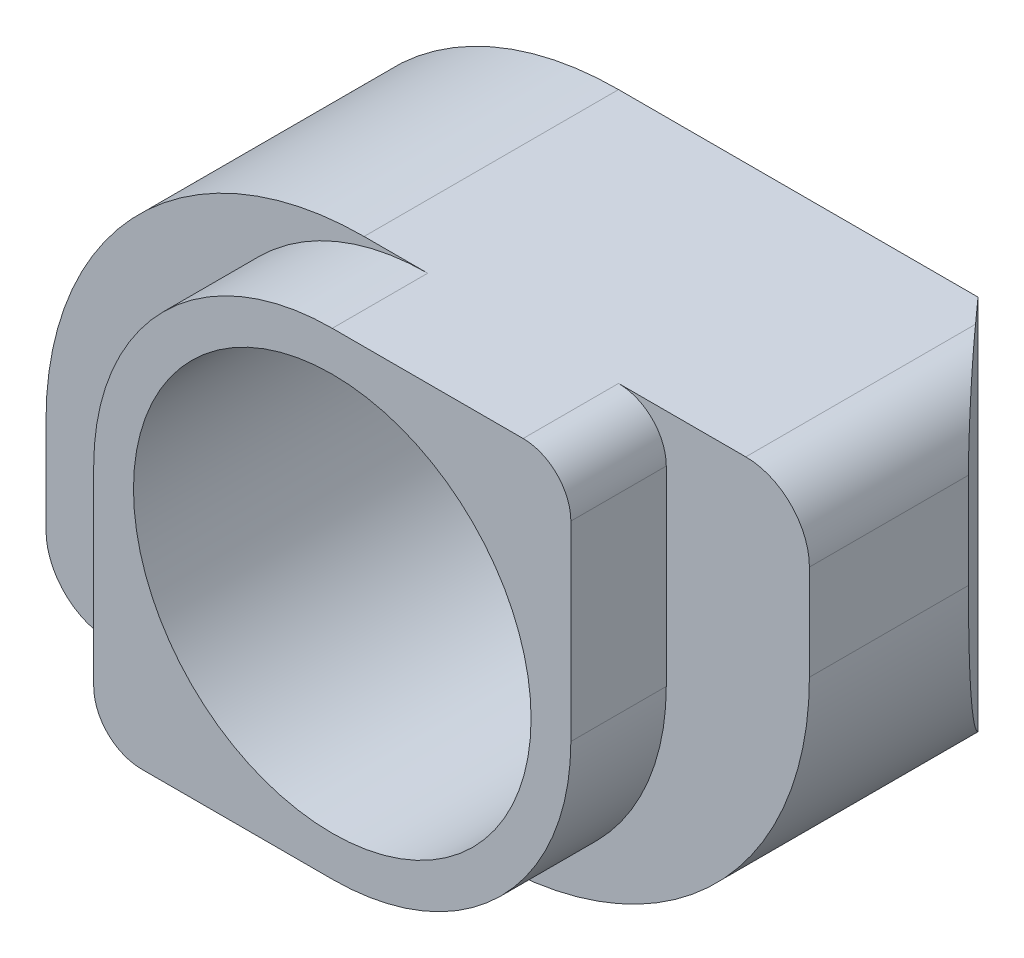
ISO-10303-21;
HEADER;
FILE_DESCRIPTION(('STEP AP214'),'2;1');
FILE_NAME('part.step','',(''),(''),'','','');
FILE_SCHEMA(('AUTOMOTIVE_DESIGN { 1 0 10303 214 1 1 1 1 }'));
ENDSEC;
DATA;
#1=APPLICATION_CONTEXT('core data for automotive mechanical design processes');
#2=APPLICATION_PROTOCOL_DEFINITION('international standard','automotive_design',2000,#1);
#3=PRODUCT_CONTEXT('',#1,'mechanical');
#4=PRODUCT('Part','Part','',(#3));
#5=PRODUCT_RELATED_PRODUCT_CATEGORY('part','',(#4));
#6=PRODUCT_DEFINITION_FORMATION('','',#4);
#7=PRODUCT_DEFINITION_CONTEXT('part definition',#1,'design');
#8=PRODUCT_DEFINITION('design','',#6,#7);
#9=PRODUCT_DEFINITION_SHAPE('','',#8);
#10=(LENGTH_UNIT() NAMED_UNIT(*) SI_UNIT(.MILLI.,.METRE.));
#11=(NAMED_UNIT(*) PLANE_ANGLE_UNIT() SI_UNIT($,.RADIAN.));
#12=(NAMED_UNIT(*) SI_UNIT($,.STERADIAN.) SOLID_ANGLE_UNIT());
#13=UNCERTAINTY_MEASURE_WITH_UNIT(LENGTH_MEASURE(1.E-05),#10,'distance_accuracy_value','');
#14=(GEOMETRIC_REPRESENTATION_CONTEXT(3) GLOBAL_UNCERTAINTY_ASSIGNED_CONTEXT((#13)) GLOBAL_UNIT_ASSIGNED_CONTEXT((#10,
#11,#12)) REPRESENTATION_CONTEXT('',''));
#15=CARTESIAN_POINT('',(0.,0.,0.));
#16=DIRECTION('',(0.,0.,1.));
#17=DIRECTION('',(1.,0.,0.));
#18=AXIS2_PLACEMENT_3D('',#15,#16,#17);
#19=CARTESIAN_POINT('',(-4.8,-3.,0.));
#20=DIRECTION('',(0.,-1.,0.));
#21=DIRECTION('',(0.,0.,-1.));
#22=AXIS2_PLACEMENT_3D('',#19,#20,#21);
#23=PLANE('',#22);
#24=DIRECTION('',(1.,0.,0.));
#25=VECTOR('',#24,1.);
#26=CARTESIAN_POINT('',(-4.8,-3.,4.));
#27=LINE('',#26,#25);
#28=CARTESIAN_POINT('',(0.,-3.,4.));
#29=VERTEX_POINT('',#28);
#30=CARTESIAN_POINT('',(0.8,-3.,4.));
#31=VERTEX_POINT('',#30);
#32=EDGE_CURVE('E233',#29,#31,#27,.T.);
#33=ORIENTED_EDGE('',*,*,#32,.F.);
#34=DIRECTION('',(0.,0.,1.));
#35=VECTOR('',#34,1.);
#36=CARTESIAN_POINT('',(0.,-3.,4.));
#37=LINE('',#36,#35);
#38=CARTESIAN_POINT('',(0.,-3.,5.2));
#39=VERTEX_POINT('',#38);
#40=EDGE_CURVE('E208',#29,#39,#37,.T.);
#41=ORIENTED_EDGE('',*,*,#40,.T.);
#42=DIRECTION('',(-1.,0.,0.));
#43=VECTOR('',#42,1.);
#44=CARTESIAN_POINT('',(-4.8,-3.,5.2));
#45=LINE('',#44,#43);
#46=CARTESIAN_POINT('',(-2.4,-3.,5.2));
#47=VERTEX_POINT('',#46);
#48=EDGE_CURVE('E60',#39,#47,#45,.T.);
#49=ORIENTED_EDGE('',*,*,#48,.T.);
#50=DIRECTION('',(0.,0.,1.));
#51=VECTOR('',#50,1.);
#52=CARTESIAN_POINT('',(-2.4,-3.,2.));
#53=LINE('',#52,#51);
#54=CARTESIAN_POINT('',(-2.4,-3.,4.));
#55=VERTEX_POINT('',#54);
#56=EDGE_CURVE('E240',#55,#47,#53,.T.);
#57=ORIENTED_EDGE('',*,*,#56,.F.);
#58=DIRECTION('',(1.,0.,0.));
#59=VECTOR('',#58,1.);
#60=CARTESIAN_POINT('',(-4.8,-3.,4.));
#61=LINE('',#60,#59);
#62=CARTESIAN_POINT('',(-4.,-3.,4.));
#63=VERTEX_POINT('',#62);
#64=EDGE_CURVE('E191',#63,#55,#61,.T.);
#65=ORIENTED_EDGE('',*,*,#64,.F.);
#66=DIRECTION('',(0.,0.,1.));
#67=VECTOR('',#66,1.);
#68=CARTESIAN_POINT('',(-4.,-3.,0.));
#69=LINE('',#68,#67);
#70=CARTESIAN_POINT('',(-4.,-3.,1.11111111111111));
#71=VERTEX_POINT('',#70);
#72=EDGE_CURVE('E232',#71,#63,#69,.T.);
#73=ORIENTED_EDGE('',*,*,#72,.F.);
#74=DIRECTION('',(0.66896473162245,0.,-0.743294146247166));
#75=VECTOR('',#74,1.);
#76=CARTESIAN_POINT('',(-4.30276243093923,-3.,1.4475138121547));
#77=LINE('',#76,#75);
#78=CARTESIAN_POINT('',(-3.72,-3.,0.8));
#79=VERTEX_POINT('',#78);
#80=EDGE_CURVE('E210',#71,#79,#77,.T.);
#81=ORIENTED_EDGE('',*,*,#80,.T.);
#82=DIRECTION('',(1.,0.,0.));
#83=VECTOR('',#82,1.);
#84=CARTESIAN_POINT('',(-4.8,-3.,0.8));
#85=LINE('',#84,#83);
#86=CARTESIAN_POINT('',(0.8,-3.,0.8));
#87=VERTEX_POINT('',#86);
#88=EDGE_CURVE('E357',#79,#87,#85,.T.);
#89=ORIENTED_EDGE('',*,*,#88,.T.);
#90=DIRECTION('',(0.,0.,-1.));
#91=VECTOR('',#90,1.);
#92=CARTESIAN_POINT('',(0.8,-3.,0.));
#93=LINE('',#92,#91);
#94=EDGE_CURVE('E253',#31,#87,#93,.T.);
#95=ORIENTED_EDGE('',*,*,#94,.F.);
#96=EDGE_LOOP('',(#33,#41,#49,#57,#65,#73,#81,#89,#95));
#97=FACE_BOUND('',#96,.T.);
#98=ADVANCED_FACE('F46',(#97),#23,.T.);
#99=CARTESIAN_POINT('',(4.8,3.,0.));
#100=DIRECTION('',(0.,1.,0.));
#101=DIRECTION('',(1.,0.,0.));
#102=AXIS2_PLACEMENT_3D('',#99,#100,#101);
#103=PLANE('',#102);
#104=DIRECTION('',(-1.,0.,0.));
#105=VECTOR('',#104,1.);
#106=CARTESIAN_POINT('',(4.8,3.,4.));
#107=LINE('',#106,#105);
#108=CARTESIAN_POINT('',(0.,3.,4.));
#109=VERTEX_POINT('',#108);
#110=CARTESIAN_POINT('',(-0.8,3.,4.));
#111=VERTEX_POINT('',#110);
#112=EDGE_CURVE('E247',#109,#111,#107,.T.);
#113=ORIENTED_EDGE('',*,*,#112,.F.);
#114=DIRECTION('',(0.,0.,1.));
#115=VECTOR('',#114,1.);
#116=CARTESIAN_POINT('',(0.,3.,4.));
#117=LINE('',#116,#115);
#118=CARTESIAN_POINT('',(0.,3.,5.2));
#119=VERTEX_POINT('',#118);
#120=EDGE_CURVE('E207',#109,#119,#117,.T.);
#121=ORIENTED_EDGE('',*,*,#120,.T.);
#122=DIRECTION('',(1.,0.,0.));
#123=VECTOR('',#122,1.);
#124=CARTESIAN_POINT('',(4.8,3.,5.2));
#125=LINE('',#124,#123);
#126=CARTESIAN_POINT('',(2.4,3.,5.2));
#127=VERTEX_POINT('',#126);
#128=EDGE_CURVE('E332',#119,#127,#125,.T.);
#129=ORIENTED_EDGE('',*,*,#128,.T.);
#130=DIRECTION('',(0.,0.,1.));
#131=VECTOR('',#130,1.);
#132=CARTESIAN_POINT('',(2.4,3.,2.));
#133=LINE('',#132,#131);
#134=CARTESIAN_POINT('',(2.4,3.,4.));
#135=VERTEX_POINT('',#134);
#136=EDGE_CURVE('E281',#135,#127,#133,.T.);
#137=ORIENTED_EDGE('',*,*,#136,.F.);
#138=DIRECTION('',(-1.,0.,0.));
#139=VECTOR('',#138,1.);
#140=CARTESIAN_POINT('',(4.8,3.,4.));
#141=LINE('',#140,#139);
#142=CARTESIAN_POINT('',(4.,3.,4.));
#143=VERTEX_POINT('',#142);
#144=EDGE_CURVE('E241',#143,#135,#141,.T.);
#145=ORIENTED_EDGE('',*,*,#144,.F.);
#146=DIRECTION('',(0.,0.,1.));
#147=VECTOR('',#146,1.);
#148=CARTESIAN_POINT('',(4.,3.,0.));
#149=LINE('',#148,#147);
#150=CARTESIAN_POINT('',(4.,3.,1.11111111111111));
#151=VERTEX_POINT('',#150);
#152=EDGE_CURVE('E219',#151,#143,#149,.T.);
#153=ORIENTED_EDGE('',*,*,#152,.F.);
#154=DIRECTION('',(-0.66896473162245,0.,-0.743294146247166));
#155=VECTOR('',#154,1.);
#156=CARTESIAN_POINT('',(3.40276243093923,3.,0.447513812154696));
#157=LINE('',#156,#155);
#158=CARTESIAN_POINT('',(3.72,3.,0.799999999999998));
#159=VERTEX_POINT('',#158);
#160=EDGE_CURVE('E203',#151,#159,#157,.T.);
#161=ORIENTED_EDGE('',*,*,#160,.T.);
#162=DIRECTION('',(-1.,0.,0.));
#163=VECTOR('',#162,1.);
#164=CARTESIAN_POINT('',(4.8,3.,0.8));
#165=LINE('',#164,#163);
#166=CARTESIAN_POINT('',(-0.8,3.,0.8));
#167=VERTEX_POINT('',#166);
#168=EDGE_CURVE('E68',#159,#167,#165,.T.);
#169=ORIENTED_EDGE('',*,*,#168,.T.);
#170=DIRECTION('',(0.,0.,-1.));
#171=VECTOR('',#170,1.);
#172=CARTESIAN_POINT('',(-0.8,3.,0.));
#173=LINE('',#172,#171);
#174=EDGE_CURVE('E289',#111,#167,#173,.T.);
#175=ORIENTED_EDGE('',*,*,#174,.F.);
#176=EDGE_LOOP('',(#113,#121,#129,#137,#145,#153,#161,#169,#175));
#177=FACE_BOUND('',#176,.T.);
#178=ADVANCED_FACE('F272',(#177),#103,.T.);
#179=CARTESIAN_POINT('',(2.4,2.4,2.));
#180=DIRECTION('',(0.,0.,1.));
#181=DIRECTION('',(0.707106781186548,0.707106781186547,0.));
#182=AXIS2_PLACEMENT_3D('',#179,#180,#181);
#183=CYLINDRICAL_SURFACE('',#182,0.6);
#184=ORIENTED_EDGE('',*,*,#136,.T.);
#185=CARTESIAN_POINT('',(2.4,2.4,5.2));
#186=DIRECTION('',(0.,0.,1.));
#187=DIRECTION('',(1.,0.,0.));
#188=AXIS2_PLACEMENT_3D('',#185,#186,#187);
#189=CIRCLE('',#188,0.6);
#190=CARTESIAN_POINT('',(3.,2.4,5.2));
#191=VERTEX_POINT('',#190);
#192=EDGE_CURVE('E184',#127,#191,#189,.F.);
#193=ORIENTED_EDGE('',*,*,#192,.T.);
#194=DIRECTION('',(0.,0.,-1.));
#195=VECTOR('',#194,1.);
#196=CARTESIAN_POINT('',(3.,2.4,2.));
#197=LINE('',#196,#195);
#198=CARTESIAN_POINT('',(3.,2.4,4.));
#199=VERTEX_POINT('',#198);
#200=EDGE_CURVE('E53',#191,#199,#197,.T.);
#201=ORIENTED_EDGE('',*,*,#200,.T.);
#202=CARTESIAN_POINT('',(2.4,2.4,4.));
#203=DIRECTION('',(0.,0.,1.));
#204=DIRECTION('',(0.707106781186548,0.707106781186547,0.));
#205=AXIS2_PLACEMENT_3D('',#202,#203,#204);
#206=CIRCLE('',#205,0.6);
#207=EDGE_CURVE('E284',#199,#135,#206,.T.);
#208=ORIENTED_EDGE('',*,*,#207,.T.);
#209=EDGE_LOOP('',(#184,#193,#201,#208));
#210=FACE_BOUND('',#209,.T.);
#211=ADVANCED_FACE('F372',(#210),#183,.T.);
#212=CARTESIAN_POINT('',(3.,0.,4.));
#213=DIRECTION('',(1.,0.,0.));
#214=DIRECTION('',(0.,1.,0.));
#215=AXIS2_PLACEMENT_3D('',#212,#213,#214);
#216=PLANE('',#215);
#217=ORIENTED_EDGE('',*,*,#200,.F.);
#218=DIRECTION('',(0.,-1.,0.));
#219=VECTOR('',#218,1.);
#220=CARTESIAN_POINT('',(3.,0.,5.2));
#221=LINE('',#220,#219);
#222=CARTESIAN_POINT('',(3.,0.,5.2));
#223=VERTEX_POINT('',#222);
#224=EDGE_CURVE('E170',#191,#223,#221,.T.);
#225=ORIENTED_EDGE('',*,*,#224,.T.);
#226=DIRECTION('',(0.,0.,1.));
#227=VECTOR('',#226,1.);
#228=CARTESIAN_POINT('',(3.,0.,4.));
#229=LINE('',#228,#227);
#230=CARTESIAN_POINT('',(3.,0.,4.));
#231=VERTEX_POINT('',#230);
#232=EDGE_CURVE('E182',#231,#223,#229,.T.);
#233=ORIENTED_EDGE('',*,*,#232,.F.);
#234=DIRECTION('',(0.,-1.,0.));
#235=VECTOR('',#234,1.);
#236=CARTESIAN_POINT('',(3.,0.,4.));
#237=LINE('',#236,#235);
#238=EDGE_CURVE('E244',#199,#231,#237,.T.);
#239=ORIENTED_EDGE('',*,*,#238,.F.);
#240=EDGE_LOOP('',(#217,#225,#233,#239));
#241=FACE_BOUND('',#240,.T.);
#242=ADVANCED_FACE('F180',(#241),#216,.T.);
#243=CARTESIAN_POINT('',(-2.4,-2.4,2.));
#244=DIRECTION('',(0.,0.,1.));
#245=DIRECTION('',(-0.707106781186548,-0.707106781186547,0.));
#246=AXIS2_PLACEMENT_3D('',#243,#244,#245);
#247=CYLINDRICAL_SURFACE('',#246,0.6);
#248=ORIENTED_EDGE('',*,*,#56,.T.);
#249=CARTESIAN_POINT('',(-2.4,-2.4,5.2));
#250=DIRECTION('',(0.,0.,1.));
#251=DIRECTION('',(1.,0.,0.));
#252=AXIS2_PLACEMENT_3D('',#249,#250,#251);
#253=CIRCLE('',#252,0.6);
#254=CARTESIAN_POINT('',(-3.,-2.4,5.2));
#255=VERTEX_POINT('',#254);
#256=EDGE_CURVE('E347',#47,#255,#253,.F.);
#257=ORIENTED_EDGE('',*,*,#256,.T.);
#258=DIRECTION('',(0.,0.,-1.));
#259=VECTOR('',#258,1.);
#260=CARTESIAN_POINT('',(-3.,-2.4,2.));
#261=LINE('',#260,#259);
#262=CARTESIAN_POINT('',(-3.,-2.4,4.));
#263=VERTEX_POINT('',#262);
#264=EDGE_CURVE('E239',#255,#263,#261,.T.);
#265=ORIENTED_EDGE('',*,*,#264,.T.);
#266=CARTESIAN_POINT('',(-2.4,-2.4,4.));
#267=DIRECTION('',(0.,0.,1.));
#268=DIRECTION('',(-0.707106781186548,-0.707106781186547,0.));
#269=AXIS2_PLACEMENT_3D('',#266,#267,#268);
#270=CIRCLE('',#269,0.6);
#271=EDGE_CURVE('E236',#263,#55,#270,.T.);
#272=ORIENTED_EDGE('',*,*,#271,.T.);
#273=EDGE_LOOP('',(#248,#257,#265,#272));
#274=FACE_BOUND('',#273,.T.);
#275=ADVANCED_FACE('F346',(#274),#247,.T.);
#276=CARTESIAN_POINT('',(-3.,0.,4.));
#277=DIRECTION('',(-1.,0.,0.));
#278=DIRECTION('',(0.,0.,1.));
#279=AXIS2_PLACEMENT_3D('',#276,#277,#278);
#280=PLANE('',#279);
#281=ORIENTED_EDGE('',*,*,#264,.F.);
#282=DIRECTION('',(0.,1.,0.));
#283=VECTOR('',#282,1.);
#284=CARTESIAN_POINT('',(-3.,0.,5.2));
#285=LINE('',#284,#283);
#286=CARTESIAN_POINT('',(-3.,0.,5.2));
#287=VERTEX_POINT('',#286);
#288=EDGE_CURVE('E325',#255,#287,#285,.T.);
#289=ORIENTED_EDGE('',*,*,#288,.T.);
#290=DIRECTION('',(0.,0.,1.));
#291=VECTOR('',#290,1.);
#292=CARTESIAN_POINT('',(-3.,0.,4.));
#293=LINE('',#292,#291);
#294=CARTESIAN_POINT('',(-3.,0.,4.));
#295=VERTEX_POINT('',#294);
#296=EDGE_CURVE('E190',#295,#287,#293,.T.);
#297=ORIENTED_EDGE('',*,*,#296,.F.);
#298=DIRECTION('',(0.,1.,0.));
#299=VECTOR('',#298,1.);
#300=CARTESIAN_POINT('',(-3.,0.,4.));
#301=LINE('',#300,#299);
#302=EDGE_CURVE('E197',#263,#295,#301,.T.);
#303=ORIENTED_EDGE('',*,*,#302,.F.);
#304=EDGE_LOOP('',(#281,#289,#297,#303));
#305=FACE_BOUND('',#304,.T.);
#306=ADVANCED_FACE('F324',(#305),#280,.T.);
#307=CARTESIAN_POINT('',(0.,0.,4.));
#308=DIRECTION('',(0.,0.,1.));
#309=DIRECTION('',(-1.,0.,0.));
#310=AXIS2_PLACEMENT_3D('',#307,#308,#309);
#311=CYLINDRICAL_SURFACE('',#310,3.);
#312=ORIENTED_EDGE('',*,*,#296,.T.);
#313=CARTESIAN_POINT('',(0.,0.,5.2));
#314=DIRECTION('',(0.,0.,1.));
#315=DIRECTION('',(1.,0.,0.));
#316=AXIS2_PLACEMENT_3D('',#313,#314,#315);
#317=CIRCLE('',#316,3.);
#318=EDGE_CURVE('E330',#287,#119,#317,.F.);
#319=ORIENTED_EDGE('',*,*,#318,.T.);
#320=ORIENTED_EDGE('',*,*,#120,.F.);
#321=CARTESIAN_POINT('',(0.,0.,4.));
#322=DIRECTION('',(0.,0.,-1.));
#323=DIRECTION('',(-1.,0.,0.));
#324=AXIS2_PLACEMENT_3D('',#321,#322,#323);
#325=CIRCLE('',#324,3.);
#326=EDGE_CURVE('E245',#295,#109,#325,.T.);
#327=ORIENTED_EDGE('',*,*,#326,.F.);
#328=EDGE_LOOP('',(#312,#319,#320,#327));
#329=FACE_BOUND('',#328,.T.);
#330=ADVANCED_FACE('F329',(#329),#311,.T.);
#331=CARTESIAN_POINT('',(0.,0.,4.));
#332=DIRECTION('',(0.,0.,1.));
#333=DIRECTION('',(-1.,0.,0.));
#334=AXIS2_PLACEMENT_3D('',#331,#332,#333);
#335=CYLINDRICAL_SURFACE('',#334,3.);
#336=ORIENTED_EDGE('',*,*,#232,.T.);
#337=CARTESIAN_POINT('',(0.,0.,5.2));
#338=DIRECTION('',(0.,0.,1.));
#339=DIRECTION('',(1.,0.,0.));
#340=AXIS2_PLACEMENT_3D('',#337,#338,#339);
#341=CIRCLE('',#340,3.);
#342=EDGE_CURVE('E167',#223,#39,#341,.F.);
#343=ORIENTED_EDGE('',*,*,#342,.T.);
#344=ORIENTED_EDGE('',*,*,#40,.F.);
#345=CARTESIAN_POINT('',(0.,0.,4.));
#346=DIRECTION('',(0.,0.,-1.));
#347=DIRECTION('',(-1.,0.,0.));
#348=AXIS2_PLACEMENT_3D('',#345,#346,#347);
#349=CIRCLE('',#348,3.);
#350=EDGE_CURVE('E189',#231,#29,#349,.T.);
#351=ORIENTED_EDGE('',*,*,#350,.F.);
#352=EDGE_LOOP('',(#336,#343,#344,#351));
#353=FACE_BOUND('',#352,.T.);
#354=ADVANCED_FACE('F187',(#353),#335,.T.);
#355=CARTESIAN_POINT('',(-4.8,-3.,2.));
#356=DIRECTION('',(0.743294146247166,0.,0.66896473162245));
#357=DIRECTION('',(0.,-1.,0.));
#358=AXIS2_PLACEMENT_3D('',#355,#356,#357);
#359=PLANE('',#358);
#360=DIRECTION('',(0.,1.,0.));
#361=VECTOR('',#360,1.);
#362=CARTESIAN_POINT('',(-3.72,-3.,0.8));
#363=LINE('',#362,#361);
#364=CARTESIAN_POINT('',(-3.72000000000001,1.73378857997468,0.8));
#365=VERTEX_POINT('',#364);
#366=EDGE_CURVE('E278',#79,#365,#363,.T.);
#367=ORIENTED_EDGE('',*,*,#366,.F.);
#368=ORIENTED_EDGE('',*,*,#80,.F.);
#369=CARTESIAN_POINT('',(-4.,-2.2,1.11111111111111));
#370=DIRECTION('',(0.743294146247166,0.,0.66896473162245));
#371=DIRECTION('',(-0.66896473162245,0.,0.743294146247166));
#372=AXIS2_PLACEMENT_3D('',#369,#370,#371);
#373=ELLIPSE('',#372,1.19587769307322,0.8);
#374=CARTESIAN_POINT('',(-4.8,-2.2,2.));
#375=VERTEX_POINT('',#374);
#376=EDGE_CURVE('E302',#375,#71,#373,.T.);
#377=ORIENTED_EDGE('',*,*,#376,.F.);
#378=DIRECTION('',(0.,-1.,0.));
#379=VECTOR('',#378,1.);
#380=CARTESIAN_POINT('',(-4.8,0.,2.));
#381=LINE('',#380,#379);
#382=CARTESIAN_POINT('',(-4.8,-1.,2.));
#383=VERTEX_POINT('',#382);
#384=EDGE_CURVE('E194',#383,#375,#381,.T.);
#385=ORIENTED_EDGE('',*,*,#384,.F.);
#386=CARTESIAN_POINT('',(-0.8,-1.,-2.44444444444445));
#387=DIRECTION('',(0.743294146247166,0.,0.66896473162245));
#388=DIRECTION('',(-0.66896473162245,0.,0.743294146247166));
#389=AXIS2_PLACEMENT_3D('',#386,#387,#388);
#390=ELLIPSE('',#389,5.97938846536609,4.);
#391=EDGE_CURVE('E201',#365,#383,#390,.T.);
#392=ORIENTED_EDGE('',*,*,#391,.F.);
#393=EDGE_LOOP('',(#367,#368,#377,#385,#392));
#394=FACE_BOUND('',#393,.T.);
#395=ADVANCED_FACE('F365',(#394),#359,.F.);
#396=CARTESIAN_POINT('',(-0.8,-1.,0.));
#397=DIRECTION('',(0.,0.,1.));
#398=DIRECTION('',(-0.707106781186548,0.707106781186548,0.));
#399=AXIS2_PLACEMENT_3D('',#396,#397,#398);
#400=CYLINDRICAL_SURFACE('',#399,4.);
#401=ORIENTED_EDGE('',*,*,#174,.T.);
#402=CARTESIAN_POINT('',(-0.8,-1.,0.8));
#403=DIRECTION('',(0.,0.,-1.));
#404=DIRECTION('',(-1.,0.,0.));
#405=AXIS2_PLACEMENT_3D('',#402,#403,#404);
#406=CIRCLE('',#405,4.);
#407=EDGE_CURVE('E358',#167,#365,#406,.F.);
#408=ORIENTED_EDGE('',*,*,#407,.T.);
#409=ORIENTED_EDGE('',*,*,#391,.T.);
#410=DIRECTION('',(0.,0.,1.));
#411=VECTOR('',#410,1.);
#412=CARTESIAN_POINT('',(-4.8,-1.,0.));
#413=LINE('',#412,#411);
#414=CARTESIAN_POINT('',(-4.8,-1.,4.));
#415=VERTEX_POINT('',#414);
#416=EDGE_CURVE('E252',#383,#415,#413,.T.);
#417=ORIENTED_EDGE('',*,*,#416,.T.);
#418=CARTESIAN_POINT('',(-0.8,-1.,4.));
#419=DIRECTION('',(0.,0.,-1.));
#420=DIRECTION('',(-0.707106781186548,0.707106781186548,0.));
#421=AXIS2_PLACEMENT_3D('',#418,#419,#420);
#422=CIRCLE('',#421,4.);
#423=EDGE_CURVE('E214',#415,#111,#422,.T.);
#424=ORIENTED_EDGE('',*,*,#423,.T.);
#425=EDGE_LOOP('',(#401,#408,#409,#417,#424));
#426=FACE_BOUND('',#425,.T.);
#427=ADVANCED_FACE('F413',(#426),#400,.T.);
#428=CARTESIAN_POINT('',(0.8,1.,0.));
#429=DIRECTION('',(0.,0.,1.));
#430=DIRECTION('',(0.707106781186548,-0.707106781186548,0.));
#431=AXIS2_PLACEMENT_3D('',#428,#429,#430);
#432=CYLINDRICAL_SURFACE('',#431,4.);
#433=ORIENTED_EDGE('',*,*,#94,.T.);
#434=CARTESIAN_POINT('',(0.8,1.,0.8));
#435=DIRECTION('',(0.,0.,-1.));
#436=DIRECTION('',(-1.,0.,0.));
#437=AXIS2_PLACEMENT_3D('',#434,#435,#436);
#438=CIRCLE('',#437,4.);
#439=CARTESIAN_POINT('',(3.72,-1.73378857997468,0.8));
#440=VERTEX_POINT('',#439);
#441=EDGE_CURVE('E349',#87,#440,#438,.F.);
#442=ORIENTED_EDGE('',*,*,#441,.T.);
#443=CARTESIAN_POINT('',(0.8,1.,-2.44444444444445));
#444=DIRECTION('',(-0.743294146247166,0.,0.66896473162245));
#445=DIRECTION('',(0.66896473162245,0.,0.743294146247166));
#446=AXIS2_PLACEMENT_3D('',#443,#444,#445);
#447=ELLIPSE('',#446,5.97938846536609,4.);
#448=CARTESIAN_POINT('',(4.8,1.,2.));
#449=VERTEX_POINT('',#448);
#450=EDGE_CURVE('E269',#440,#449,#447,.T.);
#451=ORIENTED_EDGE('',*,*,#450,.T.);
#452=DIRECTION('',(0.,0.,1.));
#453=VECTOR('',#452,1.);
#454=CARTESIAN_POINT('',(4.8,1.,0.));
#455=LINE('',#454,#453);
#456=CARTESIAN_POINT('',(4.8,1.,4.));
#457=VERTEX_POINT('',#456);
#458=EDGE_CURVE('E228',#449,#457,#455,.T.);
#459=ORIENTED_EDGE('',*,*,#458,.T.);
#460=CARTESIAN_POINT('',(0.8,1.,4.));
#461=DIRECTION('',(0.,0.,-1.));
#462=DIRECTION('',(0.707106781186548,-0.707106781186548,0.));
#463=AXIS2_PLACEMENT_3D('',#460,#461,#462);
#464=CIRCLE('',#463,4.);
#465=EDGE_CURVE('E250',#457,#31,#464,.T.);
#466=ORIENTED_EDGE('',*,*,#465,.T.);
#467=EDGE_LOOP('',(#433,#442,#451,#459,#466));
#468=FACE_BOUND('',#467,.T.);
#469=ADVANCED_FACE('F367',(#468),#432,.T.);
#470=CARTESIAN_POINT('',(3.,-3.,0.));
#471=DIRECTION('',(-0.743294146247166,0.,0.66896473162245));
#472=DIRECTION('',(0.,1.,0.));
#473=AXIS2_PLACEMENT_3D('',#470,#471,#472);
#474=PLANE('',#473);
#475=DIRECTION('',(0.,-1.,0.));
#476=VECTOR('',#475,1.);
#477=CARTESIAN_POINT('',(3.72,-3.,0.8));
#478=LINE('',#477,#476);
#479=EDGE_CURVE('E270',#159,#440,#478,.T.);
#480=ORIENTED_EDGE('',*,*,#479,.F.);
#481=ORIENTED_EDGE('',*,*,#160,.F.);
#482=CARTESIAN_POINT('',(4.,2.2,1.11111111111111));
#483=DIRECTION('',(-0.743294146247166,0.,0.66896473162245));
#484=DIRECTION('',(0.66896473162245,0.,0.743294146247166));
#485=AXIS2_PLACEMENT_3D('',#482,#483,#484);
#486=ELLIPSE('',#485,1.19587769307322,0.8);
#487=CARTESIAN_POINT('',(4.8,2.2,2.));
#488=VERTEX_POINT('',#487);
#489=EDGE_CURVE('E215',#488,#151,#486,.T.);
#490=ORIENTED_EDGE('',*,*,#489,.F.);
#491=DIRECTION('',(0.,1.,0.));
#492=VECTOR('',#491,1.);
#493=CARTESIAN_POINT('',(4.8,-3.,2.));
#494=LINE('',#493,#492);
#495=EDGE_CURVE('E222',#449,#488,#494,.T.);
#496=ORIENTED_EDGE('',*,*,#495,.F.);
#497=ORIENTED_EDGE('',*,*,#450,.F.);
#498=EDGE_LOOP('',(#480,#481,#490,#496,#497));
#499=FACE_BOUND('',#498,.T.);
#500=ADVANCED_FACE('F268',(#499),#474,.F.);
#501=CARTESIAN_POINT('',(-4.,-2.2,0.));
#502=DIRECTION('',(0.,0.,1.));
#503=DIRECTION('',(-0.707106781186548,-0.707106781186547,0.));
#504=AXIS2_PLACEMENT_3D('',#501,#502,#503);
#505=CYLINDRICAL_SURFACE('',#504,0.8);
#506=CARTESIAN_POINT('',(-4.,-2.2,4.));
#507=DIRECTION('',(0.,0.,-1.));
#508=DIRECTION('',(-0.707106781186548,-0.707106781186547,0.));
#509=AXIS2_PLACEMENT_3D('',#506,#507,#508);
#510=CIRCLE('',#509,0.8);
#511=CARTESIAN_POINT('',(-4.8,-2.2,4.));
#512=VERTEX_POINT('',#511);
#513=EDGE_CURVE('E211',#63,#512,#510,.T.);
#514=ORIENTED_EDGE('',*,*,#513,.T.);
#515=DIRECTION('',(0.,0.,-1.));
#516=VECTOR('',#515,1.);
#517=CARTESIAN_POINT('',(-4.8,-2.2,0.));
#518=LINE('',#517,#516);
#519=EDGE_CURVE('E225',#512,#375,#518,.T.);
#520=ORIENTED_EDGE('',*,*,#519,.T.);
#521=ORIENTED_EDGE('',*,*,#376,.T.);
#522=ORIENTED_EDGE('',*,*,#72,.T.);
#523=EDGE_LOOP('',(#514,#520,#521,#522));
#524=FACE_BOUND('',#523,.T.);
#525=ADVANCED_FACE('F341',(#524),#505,.T.);
#526=CARTESIAN_POINT('',(4.,2.2,0.));
#527=DIRECTION('',(0.,0.,1.));
#528=DIRECTION('',(0.707106781186548,0.707106781186547,0.));
#529=AXIS2_PLACEMENT_3D('',#526,#527,#528);
#530=CYLINDRICAL_SURFACE('',#529,0.8);
#531=CARTESIAN_POINT('',(4.,2.2,4.));
#532=DIRECTION('',(0.,0.,-1.));
#533=DIRECTION('',(0.707106781186548,0.707106781186547,0.));
#534=AXIS2_PLACEMENT_3D('',#531,#532,#533);
#535=CIRCLE('',#534,0.8);
#536=CARTESIAN_POINT('',(4.8,2.2,4.));
#537=VERTEX_POINT('',#536);
#538=EDGE_CURVE('E229',#143,#537,#535,.T.);
#539=ORIENTED_EDGE('',*,*,#538,.T.);
#540=DIRECTION('',(0.,0.,-1.));
#541=VECTOR('',#540,1.);
#542=CARTESIAN_POINT('',(4.8,2.2,0.));
#543=LINE('',#542,#541);
#544=EDGE_CURVE('E218',#537,#488,#543,.T.);
#545=ORIENTED_EDGE('',*,*,#544,.T.);
#546=ORIENTED_EDGE('',*,*,#489,.T.);
#547=ORIENTED_EDGE('',*,*,#152,.T.);
#548=EDGE_LOOP('',(#539,#545,#546,#547));
#549=FACE_BOUND('',#548,.T.);
#550=ADVANCED_FACE('F256',(#549),#530,.T.);
#551=CARTESIAN_POINT('',(0.,0.,4.));
#552=DIRECTION('',(0.,0.,1.));
#553=DIRECTION('',(1.,0.,0.));
#554=AXIS2_PLACEMENT_3D('',#551,#552,#553);
#555=PLANE('',#554);
#556=ORIENTED_EDGE('',*,*,#538,.F.);
#557=ORIENTED_EDGE('',*,*,#144,.T.);
#558=ORIENTED_EDGE('',*,*,#207,.F.);
#559=ORIENTED_EDGE('',*,*,#238,.T.);
#560=ORIENTED_EDGE('',*,*,#350,.T.);
#561=ORIENTED_EDGE('',*,*,#32,.T.);
#562=ORIENTED_EDGE('',*,*,#465,.F.);
#563=DIRECTION('',(0.,1.,0.));
#564=VECTOR('',#563,1.);
#565=CARTESIAN_POINT('',(4.8,-3.,4.));
#566=LINE('',#565,#564);
#567=EDGE_CURVE('E206',#457,#537,#566,.T.);
#568=ORIENTED_EDGE('',*,*,#567,.T.);
#569=EDGE_LOOP('',(#556,#557,#558,#559,#560,#561,#562,#568));
#570=FACE_BOUND('',#569,.T.);
#571=ADVANCED_FACE('F369',(#570),#555,.T.);
#572=CARTESIAN_POINT('',(4.8,-3.,0.));
#573=DIRECTION('',(1.,0.,0.));
#574=DIRECTION('',(0.,1.,0.));
#575=AXIS2_PLACEMENT_3D('',#572,#573,#574);
#576=PLANE('',#575);
#577=ORIENTED_EDGE('',*,*,#544,.F.);
#578=ORIENTED_EDGE('',*,*,#567,.F.);
#579=ORIENTED_EDGE('',*,*,#458,.F.);
#580=ORIENTED_EDGE('',*,*,#495,.T.);
#581=EDGE_LOOP('',(#577,#578,#579,#580));
#582=FACE_BOUND('',#581,.T.);
#583=ADVANCED_FACE('F264',(#582),#576,.T.);
#584=CARTESIAN_POINT('',(-4.8,3.,0.));
#585=DIRECTION('',(-1.,0.,0.));
#586=DIRECTION('',(0.,0.,1.));
#587=AXIS2_PLACEMENT_3D('',#584,#585,#586);
#588=PLANE('',#587);
#589=ORIENTED_EDGE('',*,*,#519,.F.);
#590=DIRECTION('',(0.,-1.,0.));
#591=VECTOR('',#590,1.);
#592=CARTESIAN_POINT('',(-4.8,3.,4.));
#593=LINE('',#592,#591);
#594=EDGE_CURVE('E293',#415,#512,#593,.T.);
#595=ORIENTED_EDGE('',*,*,#594,.F.);
#596=ORIENTED_EDGE('',*,*,#416,.F.);
#597=ORIENTED_EDGE('',*,*,#384,.T.);
#598=EDGE_LOOP('',(#589,#595,#596,#597));
#599=FACE_BOUND('',#598,.T.);
#600=ADVANCED_FACE('F338',(#599),#588,.T.);
#601=CARTESIAN_POINT('',(0.,0.,4.));
#602=DIRECTION('',(0.,0.,1.));
#603=DIRECTION('',(1.,0.,0.));
#604=AXIS2_PLACEMENT_3D('',#601,#602,#603);
#605=PLANE('',#604);
#606=ORIENTED_EDGE('',*,*,#513,.F.);
#607=ORIENTED_EDGE('',*,*,#64,.T.);
#608=ORIENTED_EDGE('',*,*,#271,.F.);
#609=ORIENTED_EDGE('',*,*,#302,.T.);
#610=ORIENTED_EDGE('',*,*,#326,.T.);
#611=ORIENTED_EDGE('',*,*,#112,.T.);
#612=ORIENTED_EDGE('',*,*,#423,.F.);
#613=ORIENTED_EDGE('',*,*,#594,.T.);
#614=EDGE_LOOP('',(#606,#607,#608,#609,#610,#611,#612,#613));
#615=FACE_BOUND('',#614,.T.);
#616=ADVANCED_FACE('F319',(#615),#605,.T.);
#617=CARTESIAN_POINT('',(0.,0.,0.8));
#618=DIRECTION('',(0.,0.,-1.));
#619=DIRECTION('',(-1.,0.,0.));
#620=AXIS2_PLACEMENT_3D('',#617,#618,#619);
#621=PLANE('',#620);
#622=CARTESIAN_POINT('',(0.,0.,0.8));
#623=DIRECTION('',(0.,0.,-1.));
#624=DIRECTION('',(-1.,0.,0.));
#625=AXIS2_PLACEMENT_3D('',#622,#623,#624);
#626=CIRCLE('',#625,2.5);
#627=CARTESIAN_POINT('',(-2.5,0.,0.8));
#628=VERTEX_POINT('',#627);
#629=EDGE_CURVE('E176',#628,#628,#626,.F.);
#630=ORIENTED_EDGE('',*,*,#629,.T.);
#631=EDGE_LOOP('',(#630));
#632=FACE_BOUND('',#631,.T.);
#633=ORIENTED_EDGE('',*,*,#407,.F.);
#634=ORIENTED_EDGE('',*,*,#168,.F.);
#635=ORIENTED_EDGE('',*,*,#479,.T.);
#636=ORIENTED_EDGE('',*,*,#441,.F.);
#637=ORIENTED_EDGE('',*,*,#88,.F.);
#638=ORIENTED_EDGE('',*,*,#366,.T.);
#639=EDGE_LOOP('',(#633,#634,#635,#636,#637,#638));
#640=FACE_BOUND('',#639,.T.);
#641=ADVANCED_FACE('F362',(#632,#640),#621,.T.);
#642=CARTESIAN_POINT('',(0.,0.,5.2));
#643=DIRECTION('',(0.,0.,1.));
#644=DIRECTION('',(1.,0.,0.));
#645=AXIS2_PLACEMENT_3D('',#642,#643,#644);
#646=PLANE('',#645);
#647=CARTESIAN_POINT('',(0.,0.,5.2));
#648=DIRECTION('',(0.,0.,1.));
#649=DIRECTION('',(1.,0.,0.));
#650=AXIS2_PLACEMENT_3D('',#647,#648,#649);
#651=CIRCLE('',#650,2.5);
#652=CARTESIAN_POINT('',(2.5,0.,5.2));
#653=VERTEX_POINT('',#652);
#654=EDGE_CURVE('E11',#653,#653,#651,.T.);
#655=ORIENTED_EDGE('',*,*,#654,.F.);
#656=EDGE_LOOP('',(#655));
#657=FACE_BOUND('',#656,.T.);
#658=ORIENTED_EDGE('',*,*,#48,.F.);
#659=ORIENTED_EDGE('',*,*,#342,.F.);
#660=ORIENTED_EDGE('',*,*,#224,.F.);
#661=ORIENTED_EDGE('',*,*,#192,.F.);
#662=ORIENTED_EDGE('',*,*,#128,.F.);
#663=ORIENTED_EDGE('',*,*,#318,.F.);
#664=ORIENTED_EDGE('',*,*,#288,.F.);
#665=ORIENTED_EDGE('',*,*,#256,.F.);
#666=EDGE_LOOP('',(#658,#659,#660,#661,#662,#663,#664,#665));
#667=FACE_BOUND('',#666,.T.);
#668=ADVANCED_FACE('F169',(#657,#667),#646,.T.);
#669=CARTESIAN_POINT('',(0.,0.,-6.27106781186547));
#670=DIRECTION('',(0.,0.,1.));
#671=DIRECTION('',(1.,0.,0.));
#672=AXIS2_PLACEMENT_3D('',#669,#670,#671);
#673=CYLINDRICAL_SURFACE('',#672,2.5);
#674=ORIENTED_EDGE('',*,*,#654,.T.);
#675=EDGE_LOOP('',(#674));
#676=FACE_BOUND('',#675,.T.);
#677=ORIENTED_EDGE('',*,*,#629,.F.);
#678=EDGE_LOOP('',(#677));
#679=FACE_BOUND('',#678,.T.);
#680=ADVANCED_FACE('F381',(#676,#679),#673,.F.);
#681=CLOSED_SHELL('',(#98,#178,#211,#242,#275,#306,#330,#354,#395,#427,#469,#500,#525,#550,#571,
#583,#600,#616,#641,#668,#680));
#682=MANIFOLD_SOLID_BREP('B2',#681);
#683=ADVANCED_BREP_SHAPE_REPRESENTATION('',(#18,#682),#14);
#684=SHAPE_DEFINITION_REPRESENTATION(#9,#683);
ENDSEC;
END-ISO-10303-21;
